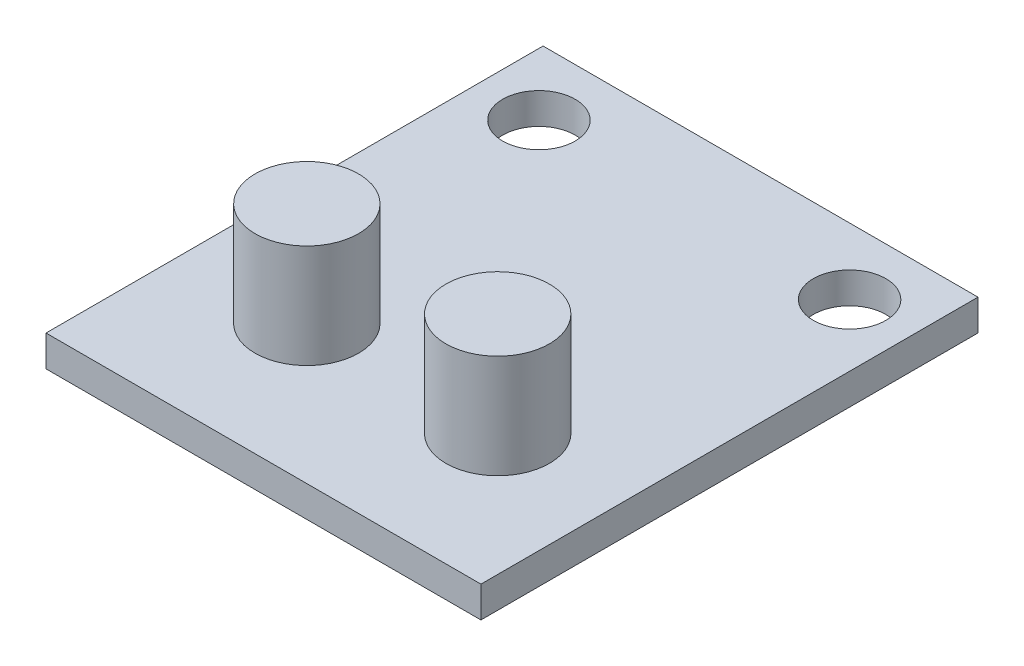
ISO-10303-21;
HEADER;
FILE_DESCRIPTION(('STEP AP214'),'2;1');
FILE_NAME('part.step','',(''),(''),'','','');
FILE_SCHEMA(('AUTOMOTIVE_DESIGN { 1 0 10303 214 1 1 1 1 }'));
ENDSEC;
DATA;
#1=APPLICATION_CONTEXT('core data for automotive mechanical design processes');
#2=APPLICATION_PROTOCOL_DEFINITION('international standard','automotive_design',2000,#1);
#3=PRODUCT_CONTEXT('',#1,'mechanical');
#4=PRODUCT('Part','Part','',(#3));
#5=PRODUCT_RELATED_PRODUCT_CATEGORY('part','',(#4));
#6=PRODUCT_DEFINITION_FORMATION('','',#4);
#7=PRODUCT_DEFINITION_CONTEXT('part definition',#1,'design');
#8=PRODUCT_DEFINITION('design','',#6,#7);
#9=PRODUCT_DEFINITION_SHAPE('','',#8);
#10=(LENGTH_UNIT() NAMED_UNIT(*) SI_UNIT(.MILLI.,.METRE.));
#11=(NAMED_UNIT(*) PLANE_ANGLE_UNIT() SI_UNIT($,.RADIAN.));
#12=(NAMED_UNIT(*) SI_UNIT($,.STERADIAN.) SOLID_ANGLE_UNIT());
#13=UNCERTAINTY_MEASURE_WITH_UNIT(LENGTH_MEASURE(1.E-05),#10,'distance_accuracy_value','');
#14=(GEOMETRIC_REPRESENTATION_CONTEXT(3) GLOBAL_UNCERTAINTY_ASSIGNED_CONTEXT((#13)) GLOBAL_UNIT_ASSIGNED_CONTEXT((#10,
#11,#12)) REPRESENTATION_CONTEXT('',''));
#15=CARTESIAN_POINT('',(0.,0.,0.));
#16=DIRECTION('',(0.,0.,1.));
#17=DIRECTION('',(1.,0.,0.));
#18=AXIS2_PLACEMENT_3D('',#15,#16,#17);
#19=CARTESIAN_POINT('',(10.5,1.5,-12.));
#20=DIRECTION('',(-1.,0.,0.));
#21=DIRECTION('',(0.,0.,1.));
#22=AXIS2_PLACEMENT_3D('',#19,#20,#21);
#23=PLANE('',#22);
#24=DIRECTION('',(0.,0.,-1.));
#25=VECTOR('',#24,1.);
#26=CARTESIAN_POINT('',(10.5,0.,-12.));
#27=LINE('',#26,#25);
#28=CARTESIAN_POINT('',(10.5,0.,12.));
#29=VERTEX_POINT('',#28);
#30=CARTESIAN_POINT('',(10.5,0.,-12.));
#31=VERTEX_POINT('',#30);
#32=EDGE_CURVE('E97',#29,#31,#27,.T.);
#33=ORIENTED_EDGE('',*,*,#32,.T.);
#34=DIRECTION('',(0.,-1.,0.));
#35=VECTOR('',#34,1.);
#36=CARTESIAN_POINT('',(10.5,1.5,-12.));
#37=LINE('',#36,#35);
#38=CARTESIAN_POINT('',(10.5,1.5,-12.));
#39=VERTEX_POINT('',#38);
#40=EDGE_CURVE('E11',#39,#31,#37,.T.);
#41=ORIENTED_EDGE('',*,*,#40,.F.);
#42=DIRECTION('',(0.,0.,-1.));
#43=VECTOR('',#42,1.);
#44=CARTESIAN_POINT('',(10.5,1.5,-12.));
#45=LINE('',#44,#43);
#46=CARTESIAN_POINT('',(10.5,1.5,12.));
#47=VERTEX_POINT('',#46);
#48=EDGE_CURVE('E85',#47,#39,#45,.T.);
#49=ORIENTED_EDGE('',*,*,#48,.F.);
#50=DIRECTION('',(0.,-1.,0.));
#51=VECTOR('',#50,1.);
#52=CARTESIAN_POINT('',(10.5,1.5,12.));
#53=LINE('',#52,#51);
#54=EDGE_CURVE('E93',#47,#29,#53,.T.);
#55=ORIENTED_EDGE('',*,*,#54,.T.);
#56=EDGE_LOOP('',(#33,#41,#49,#55));
#57=FACE_BOUND('',#56,.T.);
#58=ADVANCED_FACE('F34',(#57),#23,.F.);
#59=CARTESIAN_POINT('',(-10.5,1.5,-12.));
#60=DIRECTION('',(0.,0.,1.));
#61=DIRECTION('',(1.,0.,0.));
#62=AXIS2_PLACEMENT_3D('',#59,#60,#61);
#63=PLANE('',#62);
#64=DIRECTION('',(-1.,0.,0.));
#65=VECTOR('',#64,1.);
#66=CARTESIAN_POINT('',(-10.5,0.,-12.));
#67=LINE('',#66,#65);
#68=CARTESIAN_POINT('',(-10.5,0.,-12.));
#69=VERTEX_POINT('',#68);
#70=EDGE_CURVE('E89',#31,#69,#67,.T.);
#71=ORIENTED_EDGE('',*,*,#70,.T.);
#72=DIRECTION('',(0.,-1.,0.));
#73=VECTOR('',#72,1.);
#74=CARTESIAN_POINT('',(-10.5,1.5,-12.));
#75=LINE('',#74,#73);
#76=CARTESIAN_POINT('',(-10.5,1.5,-12.));
#77=VERTEX_POINT('',#76);
#78=EDGE_CURVE('E42',#77,#69,#75,.T.);
#79=ORIENTED_EDGE('',*,*,#78,.F.);
#80=DIRECTION('',(-1.,0.,0.));
#81=VECTOR('',#80,1.);
#82=CARTESIAN_POINT('',(-10.5,1.5,-12.));
#83=LINE('',#82,#81);
#84=EDGE_CURVE('E80',#39,#77,#83,.T.);
#85=ORIENTED_EDGE('',*,*,#84,.F.);
#86=ORIENTED_EDGE('',*,*,#40,.T.);
#87=EDGE_LOOP('',(#71,#79,#85,#86));
#88=FACE_BOUND('',#87,.T.);
#89=ADVANCED_FACE('F88',(#88),#63,.F.);
#90=CARTESIAN_POINT('',(-10.5,1.5,-12.));
#91=DIRECTION('',(1.,0.,0.));
#92=DIRECTION('',(0.,0.,-1.));
#93=AXIS2_PLACEMENT_3D('',#90,#91,#92);
#94=PLANE('',#93);
#95=DIRECTION('',(0.,0.,1.));
#96=VECTOR('',#95,1.);
#97=CARTESIAN_POINT('',(-10.5,0.,-12.));
#98=LINE('',#97,#96);
#99=CARTESIAN_POINT('',(-10.5,0.,12.));
#100=VERTEX_POINT('',#99);
#101=EDGE_CURVE('E67',#69,#100,#98,.T.);
#102=ORIENTED_EDGE('',*,*,#101,.T.);
#103=DIRECTION('',(0.,-1.,0.));
#104=VECTOR('',#103,1.);
#105=CARTESIAN_POINT('',(-10.5,1.5,12.));
#106=LINE('',#105,#104);
#107=CARTESIAN_POINT('',(-10.5,1.5,12.));
#108=VERTEX_POINT('',#107);
#109=EDGE_CURVE('E90',#108,#100,#106,.T.);
#110=ORIENTED_EDGE('',*,*,#109,.F.);
#111=DIRECTION('',(0.,0.,1.));
#112=VECTOR('',#111,1.);
#113=CARTESIAN_POINT('',(-10.5,1.5,-12.));
#114=LINE('',#113,#112);
#115=EDGE_CURVE('E83',#77,#108,#114,.T.);
#116=ORIENTED_EDGE('',*,*,#115,.F.);
#117=ORIENTED_EDGE('',*,*,#78,.T.);
#118=EDGE_LOOP('',(#102,#110,#116,#117));
#119=FACE_BOUND('',#118,.T.);
#120=ADVANCED_FACE('F91',(#119),#94,.F.);
#121=CARTESIAN_POINT('',(-10.5,1.5,12.));
#122=DIRECTION('',(0.,0.,-1.));
#123=DIRECTION('',(-1.,0.,0.));
#124=AXIS2_PLACEMENT_3D('',#121,#122,#123);
#125=PLANE('',#124);
#126=DIRECTION('',(1.,0.,0.));
#127=VECTOR('',#126,1.);
#128=CARTESIAN_POINT('',(-10.5,0.,12.));
#129=LINE('',#128,#127);
#130=EDGE_CURVE('E73',#100,#29,#129,.T.);
#131=ORIENTED_EDGE('',*,*,#130,.T.);
#132=ORIENTED_EDGE('',*,*,#54,.F.);
#133=DIRECTION('',(1.,0.,0.));
#134=VECTOR('',#133,1.);
#135=CARTESIAN_POINT('',(-10.5,1.5,12.));
#136=LINE('',#135,#134);
#137=EDGE_CURVE('E50',#108,#47,#136,.T.);
#138=ORIENTED_EDGE('',*,*,#137,.F.);
#139=ORIENTED_EDGE('',*,*,#109,.T.);
#140=EDGE_LOOP('',(#131,#132,#138,#139));
#141=FACE_BOUND('',#140,.T.);
#142=ADVANCED_FACE('F105',(#141),#125,.F.);
#143=CARTESIAN_POINT('',(0.,1.5,0.));
#144=DIRECTION('',(0.,1.,0.));
#145=DIRECTION('',(0.,0.,1.));
#146=AXIS2_PLACEMENT_3D('',#143,#144,#145);
#147=PLANE('',#146);
#148=CARTESIAN_POINT('',(4.60766594421905,1.5,5.2988158358519));
#149=DIRECTION('',(0.,1.,0.));
#150=DIRECTION('',(0.,0.,1.));
#151=AXIS2_PLACEMENT_3D('',#148,#149,#150);
#152=CIRCLE('',#151,2.5);
#153=CARTESIAN_POINT('',(4.60766594421905,1.5,7.7988158358519));
#154=VERTEX_POINT('',#153);
#155=EDGE_CURVE('E126',#154,#154,#152,.T.);
#156=ORIENTED_EDGE('',*,*,#155,.F.);
#157=EDGE_LOOP('',(#156));
#158=FACE_BOUND('',#157,.T.);
#159=CARTESIAN_POINT('',(-4.60766594421904,1.5,5.2988158358519));
#160=DIRECTION('',(0.,1.,0.));
#161=DIRECTION('',(0.,0.,1.));
#162=AXIS2_PLACEMENT_3D('',#159,#160,#161);
#163=CIRCLE('',#162,2.5);
#164=CARTESIAN_POINT('',(-4.60766594421904,1.5,7.7988158358519));
#165=VERTEX_POINT('',#164);
#166=EDGE_CURVE('E123',#165,#165,#163,.T.);
#167=ORIENTED_EDGE('',*,*,#166,.F.);
#168=EDGE_LOOP('',(#167));
#169=FACE_BOUND('',#168,.T.);
#170=CARTESIAN_POINT('',(-7.5,1.5,-8.80064195345837));
#171=DIRECTION('',(0.,1.,0.));
#172=DIRECTION('',(0.,0.,1.));
#173=AXIS2_PLACEMENT_3D('',#170,#171,#172);
#174=CIRCLE('',#173,1.75);
#175=CARTESIAN_POINT('',(-7.5,1.5,-7.05064195345837));
#176=VERTEX_POINT('',#175);
#177=EDGE_CURVE('E118',#176,#176,#174,.T.);
#178=ORIENTED_EDGE('',*,*,#177,.F.);
#179=EDGE_LOOP('',(#178));
#180=FACE_BOUND('',#179,.T.);
#181=CARTESIAN_POINT('',(7.50000000000001,1.5,-8.80064195345837));
#182=DIRECTION('',(0.,1.,0.));
#183=DIRECTION('',(0.,0.,1.));
#184=AXIS2_PLACEMENT_3D('',#181,#182,#183);
#185=CIRCLE('',#184,1.75);
#186=CARTESIAN_POINT('',(7.50000000000001,1.5,-7.05064195345838));
#187=VERTEX_POINT('',#186);
#188=EDGE_CURVE('E111',#187,#187,#185,.T.);
#189=ORIENTED_EDGE('',*,*,#188,.F.);
#190=EDGE_LOOP('',(#189));
#191=FACE_BOUND('',#190,.T.);
#192=ORIENTED_EDGE('',*,*,#48,.T.);
#193=ORIENTED_EDGE('',*,*,#84,.T.);
#194=ORIENTED_EDGE('',*,*,#115,.T.);
#195=ORIENTED_EDGE('',*,*,#137,.T.);
#196=EDGE_LOOP('',(#192,#193,#194,#195));
#197=FACE_BOUND('',#196,.T.);
#198=ADVANCED_FACE('F81',(#158,#169,#180,#191,#197),#147,.T.);
#199=CARTESIAN_POINT('',(0.,0.,0.));
#200=DIRECTION('',(0.,1.,0.));
#201=DIRECTION('',(0.,0.,1.));
#202=AXIS2_PLACEMENT_3D('',#199,#200,#201);
#203=PLANE('',#202);
#204=CARTESIAN_POINT('',(-7.5,0.,-8.80064195345837));
#205=DIRECTION('',(0.,1.,0.));
#206=DIRECTION('',(0.,0.,1.));
#207=AXIS2_PLACEMENT_3D('',#204,#205,#206);
#208=CIRCLE('',#207,1.75);
#209=CARTESIAN_POINT('',(-7.5,0.,-7.05064195345837));
#210=VERTEX_POINT('',#209);
#211=EDGE_CURVE('E100',#210,#210,#208,.T.);
#212=ORIENTED_EDGE('',*,*,#211,.T.);
#213=EDGE_LOOP('',(#212));
#214=FACE_BOUND('',#213,.T.);
#215=CARTESIAN_POINT('',(7.50000000000001,0.,-8.80064195345837));
#216=DIRECTION('',(0.,1.,0.));
#217=DIRECTION('',(0.,0.,1.));
#218=AXIS2_PLACEMENT_3D('',#215,#216,#217);
#219=CIRCLE('',#218,1.75);
#220=CARTESIAN_POINT('',(7.50000000000001,0.,-7.05064195345838));
#221=VERTEX_POINT('',#220);
#222=EDGE_CURVE('E114',#221,#221,#219,.T.);
#223=ORIENTED_EDGE('',*,*,#222,.T.);
#224=EDGE_LOOP('',(#223));
#225=FACE_BOUND('',#224,.T.);
#226=ORIENTED_EDGE('',*,*,#32,.F.);
#227=ORIENTED_EDGE('',*,*,#130,.F.);
#228=ORIENTED_EDGE('',*,*,#101,.F.);
#229=ORIENTED_EDGE('',*,*,#70,.F.);
#230=EDGE_LOOP('',(#226,#227,#228,#229));
#231=FACE_BOUND('',#230,.T.);
#232=ADVANCED_FACE('F108',(#214,#225,#231),#203,.F.);
#233=CARTESIAN_POINT('',(7.50000000000001,0.,-8.80064195345837));
#234=DIRECTION('',(0.,1.,0.));
#235=DIRECTION('',(0.,0.,1.));
#236=AXIS2_PLACEMENT_3D('',#233,#234,#235);
#237=CYLINDRICAL_SURFACE('',#236,1.75);
#238=ORIENTED_EDGE('',*,*,#222,.F.);
#239=EDGE_LOOP('',(#238));
#240=FACE_BOUND('',#239,.T.);
#241=ORIENTED_EDGE('',*,*,#188,.T.);
#242=EDGE_LOOP('',(#241));
#243=FACE_BOUND('',#242,.T.);
#244=ADVANCED_FACE('F146',(#240,#243),#237,.F.);
#245=CARTESIAN_POINT('',(-7.5,0.,-8.80064195345837));
#246=DIRECTION('',(0.,1.,0.));
#247=DIRECTION('',(0.,0.,1.));
#248=AXIS2_PLACEMENT_3D('',#245,#246,#247);
#249=CYLINDRICAL_SURFACE('',#248,1.75);
#250=ORIENTED_EDGE('',*,*,#211,.F.);
#251=EDGE_LOOP('',(#250));
#252=FACE_BOUND('',#251,.T.);
#253=ORIENTED_EDGE('',*,*,#177,.T.);
#254=EDGE_LOOP('',(#253));
#255=FACE_BOUND('',#254,.T.);
#256=ADVANCED_FACE('F148',(#252,#255),#249,.F.);
#257=CARTESIAN_POINT('',(-4.60766594421904,6.5,5.2988158358519));
#258=DIRECTION('',(0.,-1.,0.));
#259=DIRECTION('',(0.,0.,-1.));
#260=AXIS2_PLACEMENT_3D('',#257,#258,#259);
#261=CYLINDRICAL_SURFACE('',#260,2.5);
#262=CARTESIAN_POINT('',(-4.60766594421904,6.5,5.2988158358519));
#263=DIRECTION('',(0.,1.,0.));
#264=DIRECTION('',(0.,0.,1.));
#265=AXIS2_PLACEMENT_3D('',#262,#263,#264);
#266=CIRCLE('',#265,2.5);
#267=CARTESIAN_POINT('',(-4.60766594421904,6.5,7.7988158358519));
#268=VERTEX_POINT('',#267);
#269=EDGE_CURVE('E115',#268,#268,#266,.T.);
#270=ORIENTED_EDGE('',*,*,#269,.F.);
#271=EDGE_LOOP('',(#270));
#272=FACE_BOUND('',#271,.T.);
#273=ORIENTED_EDGE('',*,*,#166,.T.);
#274=EDGE_LOOP('',(#273));
#275=FACE_BOUND('',#274,.T.);
#276=ADVANCED_FACE('F155',(#272,#275),#261,.T.);
#277=CARTESIAN_POINT('',(-4.60766594421904,6.5,5.2988158358519));
#278=DIRECTION('',(0.,1.,0.));
#279=DIRECTION('',(0.,0.,1.));
#280=AXIS2_PLACEMENT_3D('',#277,#278,#279);
#281=PLANE('',#280);
#282=ORIENTED_EDGE('',*,*,#269,.T.);
#283=EDGE_LOOP('',(#282));
#284=FACE_BOUND('',#283,.T.);
#285=ADVANCED_FACE('F202',(#284),#281,.T.);
#286=CARTESIAN_POINT('',(4.60766594421905,6.5,5.2988158358519));
#287=DIRECTION('',(0.,-1.,0.));
#288=DIRECTION('',(0.,0.,-1.));
#289=AXIS2_PLACEMENT_3D('',#286,#287,#288);
#290=CYLINDRICAL_SURFACE('',#289,2.5);
#291=CARTESIAN_POINT('',(4.60766594421905,6.5,5.2988158358519));
#292=DIRECTION('',(0.,1.,0.));
#293=DIRECTION('',(0.,0.,1.));
#294=AXIS2_PLACEMENT_3D('',#291,#292,#293);
#295=CIRCLE('',#294,2.5);
#296=CARTESIAN_POINT('',(4.60766594421905,6.5,7.7988158358519));
#297=VERTEX_POINT('',#296);
#298=EDGE_CURVE('E129',#297,#297,#295,.T.);
#299=ORIENTED_EDGE('',*,*,#298,.F.);
#300=EDGE_LOOP('',(#299));
#301=FACE_BOUND('',#300,.T.);
#302=ORIENTED_EDGE('',*,*,#155,.T.);
#303=EDGE_LOOP('',(#302));
#304=FACE_BOUND('',#303,.T.);
#305=ADVANCED_FACE('F135',(#301,#304),#290,.T.);
#306=CARTESIAN_POINT('',(4.60766594421905,6.5,5.2988158358519));
#307=DIRECTION('',(0.,1.,0.));
#308=DIRECTION('',(0.,0.,1.));
#309=AXIS2_PLACEMENT_3D('',#306,#307,#308);
#310=PLANE('',#309);
#311=ORIENTED_EDGE('',*,*,#298,.T.);
#312=EDGE_LOOP('',(#311));
#313=FACE_BOUND('',#312,.T.);
#314=ADVANCED_FACE('F216',(#313),#310,.T.);
#315=CLOSED_SHELL('',(#58,#89,#120,#142,#198,#232,#244,#256,#276,#285,#305,#314));
#316=MANIFOLD_SOLID_BREP('B2',#315);
#317=ADVANCED_BREP_SHAPE_REPRESENTATION('',(#18,#316),#14);
#318=SHAPE_DEFINITION_REPRESENTATION(#9,#317);
ENDSEC;
END-ISO-10303-21;
